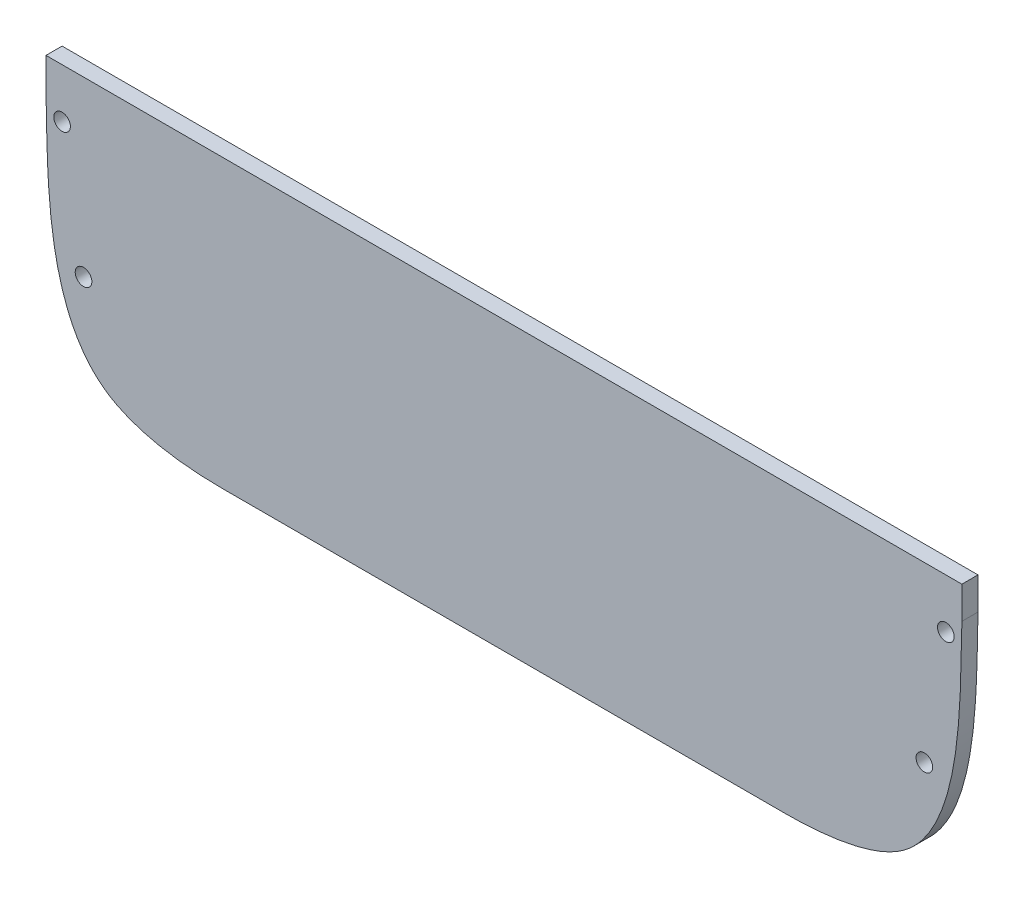
ISO-10303-21;
HEADER;
FILE_DESCRIPTION(('STEP AP214'),'2;1');
FILE_NAME('part.step','',(''),(''),'','','');
FILE_SCHEMA(('AUTOMOTIVE_DESIGN { 1 0 10303 214 1 1 1 1 }'));
ENDSEC;
DATA;
#1=APPLICATION_CONTEXT('core data for automotive mechanical design processes');
#2=APPLICATION_PROTOCOL_DEFINITION('international standard','automotive_design',2000,#1);
#3=PRODUCT_CONTEXT('',#1,'mechanical');
#4=PRODUCT('Part','Part','',(#3));
#5=PRODUCT_RELATED_PRODUCT_CATEGORY('part','',(#4));
#6=PRODUCT_DEFINITION_FORMATION('','',#4);
#7=PRODUCT_DEFINITION_CONTEXT('part definition',#1,'design');
#8=PRODUCT_DEFINITION('design','',#6,#7);
#9=PRODUCT_DEFINITION_SHAPE('','',#8);
#10=(LENGTH_UNIT() NAMED_UNIT(*) SI_UNIT(.MILLI.,.METRE.));
#11=(NAMED_UNIT(*) PLANE_ANGLE_UNIT() SI_UNIT($,.RADIAN.));
#12=(NAMED_UNIT(*) SI_UNIT($,.STERADIAN.) SOLID_ANGLE_UNIT());
#13=UNCERTAINTY_MEASURE_WITH_UNIT(LENGTH_MEASURE(1.E-05),#10,'distance_accuracy_value','');
#14=(GEOMETRIC_REPRESENTATION_CONTEXT(3) GLOBAL_UNCERTAINTY_ASSIGNED_CONTEXT((#13)) GLOBAL_UNIT_ASSIGNED_CONTEXT((#10,
#11,#12)) REPRESENTATION_CONTEXT('',''));
#15=CARTESIAN_POINT('',(0.,0.,0.));
#16=DIRECTION('',(0.,0.,1.));
#17=DIRECTION('',(1.,0.,0.));
#18=AXIS2_PLACEMENT_3D('',#15,#16,#17);
#19=CARTESIAN_POINT('',(105.,-56.,6.));
#20=CARTESIAN_POINT('',(105.641968687663,-55.9999993652091,6.));
#21=CARTESIAN_POINT('',(106.905885896746,-55.9924323496524,6.));
#22=CARTESIAN_POINT('',(109.5935841359,-55.9420924574465,6.));
#23=CARTESIAN_POINT('',(113.112089798758,-55.8039167446171,6.));
#24=CARTESIAN_POINT('',(117.546310091513,-55.4885893167127,6.));
#25=CARTESIAN_POINT('',(123.622789186208,-54.8307609589377,6.));
#26=CARTESIAN_POINT('',(131.329474875731,-53.4957798875544,6.));
#27=CARTESIAN_POINT('',(140.1159887598,-50.8648926962675,6.));
#28=CARTESIAN_POINT('',(147.740986476691,-47.0906402803281,6.));
#29=CARTESIAN_POINT('',(153.788973422215,-41.9963696791788,6.));
#30=CARTESIAN_POINT('',(158.719183517549,-35.5362268455508,6.));
#31=CARTESIAN_POINT('',(163.891886547412,-25.3514251094577,6.));
#32=CARTESIAN_POINT('',(167.170625501384,-13.2342724268467,6.));
#33=CARTESIAN_POINT('',(169.039164203445,-0.266842996610137,6.));
#34=CARTESIAN_POINT('',(169.889474507031,9.60871022523325,6.));
#35=CARTESIAN_POINT('',(170.343400930899,19.3669868942315,6.));
#36=CARTESIAN_POINT('',(170.526148900143,27.1840544966824,6.));
#37=CARTESIAN_POINT('',(170.637287987842,33.1229577325633,6.));
#38=CARTESIAN_POINT('',(170.706798383872,36.5378874436119,6.));
#39=CARTESIAN_POINT('',(170.755319597096,38.4576836054321,6.));
#40=CARTESIAN_POINT('',(170.770080312741,39.0002185189487,6.));
#41=B_SPLINE_CURVE_WITH_KNOTS('',3,(#19,#20,#21,#22,#23,#24,#25,#26,#27,#28,#29,#30,#31,#32,#33,
#34,#35,#36,#37,#38,#39,#40),.UNSPECIFIED.,.F.,.F.,(4,1,1,1,1,1,1,1,1,1,1,1,1,1,1,1,1,1,1,4),
(0.,0.015625,0.03125,0.0625,0.09375,0.125,0.1875,0.25,0.3125,0.375,0.4375,0.5,0.625,0.6875,0.75,
0.8125,0.875,0.90625,0.9375,0.949996941041021),.UNSPECIFIED.);
#42=DIRECTION('',(0.,0.,-1.));
#43=VECTOR('',#42,1.);
#44=SURFACE_OF_LINEAR_EXTRUSION('',#41,#43);
#45=CARTESIAN_POINT('',(105.,-56.,0.));
#46=CARTESIAN_POINT('',(105.641968687663,-55.9999993652091,0.));
#47=CARTESIAN_POINT('',(106.905885896746,-55.9924323496524,0.));
#48=CARTESIAN_POINT('',(109.5935841359,-55.9420924574465,0.));
#49=CARTESIAN_POINT('',(113.112089798758,-55.8039167446171,0.));
#50=CARTESIAN_POINT('',(117.546310091513,-55.4885893167127,0.));
#51=CARTESIAN_POINT('',(123.622789186208,-54.8307609589377,0.));
#52=CARTESIAN_POINT('',(131.329474875731,-53.4957798875544,0.));
#53=CARTESIAN_POINT('',(140.1159887598,-50.8648926962675,0.));
#54=CARTESIAN_POINT('',(147.740986476691,-47.0906402803281,0.));
#55=CARTESIAN_POINT('',(153.788973422215,-41.9963696791788,0.));
#56=CARTESIAN_POINT('',(158.719183517549,-35.5362268455508,0.));
#57=CARTESIAN_POINT('',(163.891886547412,-25.3514251094577,0.));
#58=CARTESIAN_POINT('',(167.170625501384,-13.2342724268467,0.));
#59=CARTESIAN_POINT('',(169.039164203445,-0.266842996610137,0.));
#60=CARTESIAN_POINT('',(169.889474507031,9.60871022523325,0.));
#61=CARTESIAN_POINT('',(170.343400930899,19.3669868942315,0.));
#62=CARTESIAN_POINT('',(170.526148900143,27.1840544966824,0.));
#63=CARTESIAN_POINT('',(170.637287987842,33.1229577325633,0.));
#64=CARTESIAN_POINT('',(170.706798383872,36.5378874436119,0.));
#65=CARTESIAN_POINT('',(170.755319597096,38.4576836054321,0.));
#66=CARTESIAN_POINT('',(170.770080312741,39.0002185189487,0.));
#67=B_SPLINE_CURVE_WITH_KNOTS('',3,(#45,#46,#47,#48,#49,#50,#51,#52,#53,#54,#55,#56,#57,#58,#59,
#60,#61,#62,#63,#64,#65,#66),.UNSPECIFIED.,.F.,.F.,(4,1,1,1,1,1,1,1,1,1,1,1,1,1,1,1,1,1,1,4),
(0.,0.015625,0.03125,0.0625,0.09375,0.125,0.1875,0.25,0.3125,0.375,0.4375,0.5,0.625,0.6875,0.75,
0.8125,0.875,0.90625,0.9375,0.949996941041021),.UNSPECIFIED.);
#68=CARTESIAN_POINT('',(105.,-56.,0.));
#69=VERTEX_POINT('',#68);
#70=CARTESIAN_POINT('',(170.770074367148,39.0001092594202,0.));
#71=VERTEX_POINT('',#70);
#72=EDGE_CURVE('E239',#69,#71,#67,.T.);
#73=ORIENTED_EDGE('',*,*,#72,.T.);
#74=DIRECTION('',(0.,0.,-1.));
#75=VECTOR('',#74,1.);
#76=CARTESIAN_POINT('',(170.770074367148,39.0001092594202,6.));
#77=LINE('',#76,#75);
#78=CARTESIAN_POINT('',(170.770074367148,39.0001092594202,6.));
#79=VERTEX_POINT('',#78);
#80=EDGE_CURVE('E11',#79,#71,#77,.T.);
#81=ORIENTED_EDGE('',*,*,#80,.F.);
#82=CARTESIAN_POINT('',(170.770077337939,39.0001091785949,6.));
#83=CARTESIAN_POINT('',(170.755317734803,38.4576099215474,6.));
#84=CARTESIAN_POINT('',(170.706797605762,36.5378492163535,6.));
#85=CARTESIAN_POINT('',(170.637287987842,33.1229577325633,6.));
#86=CARTESIAN_POINT('',(170.526148900143,27.1840544966824,6.));
#87=CARTESIAN_POINT('',(170.343400930899,19.3669868942315,6.));
#88=CARTESIAN_POINT('',(169.889474507031,9.60871022523325,6.));
#89=CARTESIAN_POINT('',(169.039164203445,-0.266842996610137,6.));
#90=CARTESIAN_POINT('',(167.170625501384,-13.2342724268467,6.));
#91=CARTESIAN_POINT('',(163.891886547412,-25.3514251094577,6.));
#92=CARTESIAN_POINT('',(158.719183517549,-35.5362268455508,6.));
#93=CARTESIAN_POINT('',(153.788973422215,-41.9963696791788,6.));
#94=CARTESIAN_POINT('',(147.740986476691,-47.0906402803281,6.));
#95=CARTESIAN_POINT('',(140.1159887598,-50.8648926962675,6.));
#96=CARTESIAN_POINT('',(131.329474875731,-53.4957798875544,6.));
#97=CARTESIAN_POINT('',(123.622789186208,-54.8307609589377,6.));
#98=CARTESIAN_POINT('',(117.546310091513,-55.4885893167127,6.));
#99=CARTESIAN_POINT('',(113.112089798758,-55.8039167446171,6.));
#100=CARTESIAN_POINT('',(109.5935841359,-55.9420924574465,6.));
#101=CARTESIAN_POINT('',(106.905885896746,-55.9924323496524,6.));
#102=CARTESIAN_POINT('',(105.641968687663,-55.9999993652091,6.));
#103=CARTESIAN_POINT('',(105.,-56.,6.));
#104=B_SPLINE_CURVE_WITH_KNOTS('',3,(#82,#83,#84,#85,#86,#87,#88,#89,#90,#91,#92,#93,#94,#95,
#96,#97,#98,#99,#100,#101,#102,#103),.UNSPECIFIED.,.F.,.F.,(4,1,1,1,1,1,1,1,1,1,1,1,1,1,1,1,1,1,
1,4),(0.,0.0124961015135081,0.0437461015135081,0.0749961015135081,0.137496101513508,
0.199996101513508,0.262496101513508,0.324996101513508,0.449996101513508,0.512496101513508,
0.574996101513508,0.637496101513508,0.699996101513508,0.762496101513508,0.824996101513508,
0.856246101513508,0.887496101513508,0.918746101513508,0.934371101513508,0.949996101513508),.UNSPECIFIED.);
#105=CARTESIAN_POINT('',(105.,-56.,6.));
#106=VERTEX_POINT('',#105);
#107=EDGE_CURVE('E186',#106,#79,#104,.F.);
#108=ORIENTED_EDGE('',*,*,#107,.F.);
#109=DIRECTION('',(0.,0.,-1.));
#110=VECTOR('',#109,1.);
#111=CARTESIAN_POINT('',(105.,-56.,6.));
#112=LINE('',#111,#110);
#113=EDGE_CURVE('E170',#106,#69,#112,.T.);
#114=ORIENTED_EDGE('',*,*,#113,.T.);
#115=EDGE_LOOP('',(#73,#81,#108,#114));
#116=FACE_BOUND('',#115,.T.);
#117=ADVANCED_FACE('F39',(#116),#44,.F.);
#118=CARTESIAN_POINT('',(170.7700550437,-8.46115385921929E-05,6.));
#119=DIRECTION('',(-0.999999999999877,4.95470582184509E-07,0.));
#120=DIRECTION('',(-4.95470582184509E-07,-0.999999999999877,0.));
#121=AXIS2_PLACEMENT_3D('',#118,#119,#120);
#122=PLANE('',#121);
#123=DIRECTION('',(4.95470582184509E-07,0.999999999999877,0.));
#124=VECTOR('',#123,1.);
#125=CARTESIAN_POINT('',(170.7700550437,-8.46115385921929E-05,0.));
#126=LINE('',#125,#124);
#127=CARTESIAN_POINT('',(170.770080312741,51.,0.));
#128=VERTEX_POINT('',#127);
#129=EDGE_CURVE('E173',#71,#128,#126,.T.);
#130=ORIENTED_EDGE('',*,*,#129,.T.);
#131=DIRECTION('',(0.,0.,-1.));
#132=VECTOR('',#131,1.);
#133=CARTESIAN_POINT('',(170.770080312741,51.,6.));
#134=LINE('',#133,#132);
#135=CARTESIAN_POINT('',(170.770080312741,51.,6.));
#136=VERTEX_POINT('',#135);
#137=EDGE_CURVE('E50',#136,#128,#134,.T.);
#138=ORIENTED_EDGE('',*,*,#137,.F.);
#139=DIRECTION('',(4.95470582184509E-07,0.999999999999877,0.));
#140=VECTOR('',#139,1.);
#141=CARTESIAN_POINT('',(170.7700550437,-8.46115385921929E-05,6.));
#142=LINE('',#141,#140);
#143=EDGE_CURVE('E97',#79,#136,#142,.T.);
#144=ORIENTED_EDGE('',*,*,#143,.F.);
#145=ORIENTED_EDGE('',*,*,#80,.T.);
#146=EDGE_LOOP('',(#130,#138,#144,#145));
#147=FACE_BOUND('',#146,.T.);
#148=ADVANCED_FACE('F292',(#147),#122,.F.);
#149=CARTESIAN_POINT('',(-1.80482557077485E-13,50.9999999999994,6.));
#150=DIRECTION('',(0.,-1.,0.));
#151=DIRECTION('',(1.,0.,0.));
#152=AXIS2_PLACEMENT_3D('',#149,#150,#151);
#153=PLANE('',#152);
#154=DIRECTION('',(-1.,0.,0.));
#155=VECTOR('',#154,1.);
#156=CARTESIAN_POINT('',(-1.80482557077485E-13,50.9999999999994,0.));
#157=LINE('',#156,#155);
#158=CARTESIAN_POINT('',(-170.770080312741,51.,0.));
#159=VERTEX_POINT('',#158);
#160=EDGE_CURVE('E171',#128,#159,#157,.T.);
#161=ORIENTED_EDGE('',*,*,#160,.T.);
#162=DIRECTION('',(0.,0.,-1.));
#163=VECTOR('',#162,1.);
#164=CARTESIAN_POINT('',(-170.770080312741,51.,6.));
#165=LINE('',#164,#163);
#166=CARTESIAN_POINT('',(-170.770080312741,51.,6.));
#167=VERTEX_POINT('',#166);
#168=EDGE_CURVE('E121',#167,#159,#165,.T.);
#169=ORIENTED_EDGE('',*,*,#168,.F.);
#170=DIRECTION('',(-1.,0.,0.));
#171=VECTOR('',#170,1.);
#172=CARTESIAN_POINT('',(-1.80482557077485E-13,50.9999999999994,6.));
#173=LINE('',#172,#171);
#174=EDGE_CURVE('E112',#136,#167,#173,.T.);
#175=ORIENTED_EDGE('',*,*,#174,.F.);
#176=ORIENTED_EDGE('',*,*,#137,.T.);
#177=EDGE_LOOP('',(#161,#169,#175,#176));
#178=FACE_BOUND('',#177,.T.);
#179=ADVANCED_FACE('F191',(#178),#153,.F.);
#180=CARTESIAN_POINT('',(-170.770067678295,-4.2305558737423E-05,6.));
#181=DIRECTION('',(0.999999999999969,2.47734039768135E-07,0.));
#182=DIRECTION('',(-2.47734039768135E-07,0.999999999999969,0.));
#183=AXIS2_PLACEMENT_3D('',#180,#181,#182);
#184=PLANE('',#183);
#185=DIRECTION('',(2.47734039768135E-07,-0.999999999999969,0.));
#186=VECTOR('',#185,1.);
#187=CARTESIAN_POINT('',(-170.770067678295,-4.2305558737423E-05,0.));
#188=LINE('',#187,#186);
#189=CARTESIAN_POINT('',(-170.77007733996,39.0001092594744,0.));
#190=VERTEX_POINT('',#189);
#191=EDGE_CURVE('E120',#159,#190,#188,.T.);
#192=ORIENTED_EDGE('',*,*,#191,.T.);
#193=DIRECTION('',(0.,0.,-1.));
#194=VECTOR('',#193,1.);
#195=CARTESIAN_POINT('',(-170.77007733996,39.0001092594744,6.));
#196=LINE('',#195,#194);
#197=CARTESIAN_POINT('',(-170.77007733996,39.0001092594744,6.));
#198=VERTEX_POINT('',#197);
#199=EDGE_CURVE('E117',#198,#190,#196,.T.);
#200=ORIENTED_EDGE('',*,*,#199,.F.);
#201=DIRECTION('',(2.47734039768135E-07,-0.999999999999969,0.));
#202=VECTOR('',#201,1.);
#203=CARTESIAN_POINT('',(-170.770067678295,-4.2305558737423E-05,6.));
#204=LINE('',#203,#202);
#205=EDGE_CURVE('E104',#167,#198,#204,.T.);
#206=ORIENTED_EDGE('',*,*,#205,.F.);
#207=ORIENTED_EDGE('',*,*,#168,.T.);
#208=EDGE_LOOP('',(#192,#200,#206,#207));
#209=FACE_BOUND('',#208,.T.);
#210=ADVANCED_FACE('F118',(#209),#184,.F.);
#211=CARTESIAN_POINT('',(-170.770080312741,39.0002185189482,6.));
#212=CARTESIAN_POINT('',(-170.755319597046,38.457683604145,6.));
#213=CARTESIAN_POINT('',(-170.706798383747,36.5378874410862,6.));
#214=CARTESIAN_POINT('',(-170.637287987626,33.1229577287414,6.));
#215=CARTESIAN_POINT('',(-170.526148899818,27.1840544930346,6.));
#216=CARTESIAN_POINT('',(-170.343400930431,19.3669868908134,6.));
#217=CARTESIAN_POINT('',(-169.889474506392,9.60871022210638,6.));
#218=CARTESIAN_POINT('',(-169.039164202644,-0.266842999434943,6.));
#219=CARTESIAN_POINT('',(-167.170625500392,-13.2342724292607,6.));
#220=CARTESIAN_POINT('',(-163.891886546286,-25.3514251114587,6.));
#221=CARTESIAN_POINT('',(-158.71918351638,-35.5362268471591,6.));
#222=CARTESIAN_POINT('',(-153.788973421066,-41.9963696805067,6.));
#223=CARTESIAN_POINT('',(-147.740986475621,-47.0906402813942,6.));
#224=CARTESIAN_POINT('',(-140.11598875888,-50.8648926970801,6.));
#225=CARTESIAN_POINT('',(-131.329474875016,-53.4957798881247,6.));
#226=CARTESIAN_POINT('',(-123.622789185691,-54.8307609593236,6.));
#227=CARTESIAN_POINT('',(-117.546310091159,-55.4885893169647,6.));
#228=CARTESIAN_POINT('',(-113.112089798527,-55.8039167447762,6.));
#229=CARTESIAN_POINT('',(-109.593584135768,-55.942092457535,6.));
#230=CARTESIAN_POINT('',(-106.905885896691,-55.9924323496887,6.));
#231=CARTESIAN_POINT('',(-105.641968687644,-55.9999993652212,6.));
#232=CARTESIAN_POINT('',(-105.,-56.,6.));
#233=B_SPLINE_CURVE_WITH_KNOTS('',3,(#211,#212,#213,#214,#215,#216,#217,#218,#219,#220,#221,
#222,#223,#224,#225,#226,#227,#228,#229,#230,#231,#232),.UNSPECIFIED.,.F.,.F.,(4,1,1,1,1,1,1,1,
1,1,1,1,1,1,1,1,1,1,1,4),(0.0500030589283113,0.0625,0.09375,0.125,0.1875,0.25,0.3125,0.375,0.5,
0.5625,0.625,0.6875,0.75,0.8125,0.875,0.90625,0.9375,0.96875,0.984375,1.),.UNSPECIFIED.);
#234=DIRECTION('',(0.,0.,-1.));
#235=VECTOR('',#234,1.);
#236=SURFACE_OF_LINEAR_EXTRUSION('',#233,#235);
#237=CARTESIAN_POINT('',(-170.770080312741,39.0002185189482,0.));
#238=CARTESIAN_POINT('',(-170.755319597046,38.457683604145,0.));
#239=CARTESIAN_POINT('',(-170.706798383747,36.5378874410862,0.));
#240=CARTESIAN_POINT('',(-170.637287987626,33.1229577287414,0.));
#241=CARTESIAN_POINT('',(-170.526148899818,27.1840544930346,0.));
#242=CARTESIAN_POINT('',(-170.343400930431,19.3669868908134,0.));
#243=CARTESIAN_POINT('',(-169.889474506392,9.60871022210638,0.));
#244=CARTESIAN_POINT('',(-169.039164202644,-0.266842999434943,0.));
#245=CARTESIAN_POINT('',(-167.170625500392,-13.2342724292607,0.));
#246=CARTESIAN_POINT('',(-163.891886546286,-25.3514251114587,0.));
#247=CARTESIAN_POINT('',(-158.71918351638,-35.5362268471591,0.));
#248=CARTESIAN_POINT('',(-153.788973421066,-41.9963696805067,0.));
#249=CARTESIAN_POINT('',(-147.740986475621,-47.0906402813942,0.));
#250=CARTESIAN_POINT('',(-140.11598875888,-50.8648926970801,0.));
#251=CARTESIAN_POINT('',(-131.329474875016,-53.4957798881247,0.));
#252=CARTESIAN_POINT('',(-123.622789185691,-54.8307609593236,0.));
#253=CARTESIAN_POINT('',(-117.546310091159,-55.4885893169647,0.));
#254=CARTESIAN_POINT('',(-113.112089798527,-55.8039167447762,0.));
#255=CARTESIAN_POINT('',(-109.593584135768,-55.942092457535,0.));
#256=CARTESIAN_POINT('',(-106.905885896691,-55.9924323496887,0.));
#257=CARTESIAN_POINT('',(-105.641968687644,-55.9999993652212,0.));
#258=CARTESIAN_POINT('',(-105.,-56.,0.));
#259=B_SPLINE_CURVE_WITH_KNOTS('',3,(#237,#238,#239,#240,#241,#242,#243,#244,#245,#246,#247,
#248,#249,#250,#251,#252,#253,#254,#255,#256,#257,#258),.UNSPECIFIED.,.F.,.F.,(4,1,1,1,1,1,1,1,
1,1,1,1,1,1,1,1,1,1,1,4),(0.0500030589283113,0.0625,0.09375,0.125,0.1875,0.25,0.3125,0.375,0.5,
0.5625,0.625,0.6875,0.75,0.8125,0.875,0.90625,0.9375,0.96875,0.984375,1.),.UNSPECIFIED.);
#260=CARTESIAN_POINT('',(-105.,-56.,0.));
#261=VERTEX_POINT('',#260);
#262=EDGE_CURVE('E82',#190,#261,#259,.T.);
#263=ORIENTED_EDGE('',*,*,#262,.T.);
#264=DIRECTION('',(0.,0.,-1.));
#265=VECTOR('',#264,1.);
#266=CARTESIAN_POINT('',(-105.,-56.,6.));
#267=LINE('',#266,#265);
#268=CARTESIAN_POINT('',(-105.,-56.,6.));
#269=VERTEX_POINT('',#268);
#270=EDGE_CURVE('E122',#269,#261,#267,.T.);
#271=ORIENTED_EDGE('',*,*,#270,.F.);
#272=CARTESIAN_POINT('',(-105.,-56.,6.));
#273=CARTESIAN_POINT('',(-105.641968687644,-55.9999993652212,6.));
#274=CARTESIAN_POINT('',(-106.905885896691,-55.9924323496887,6.));
#275=CARTESIAN_POINT('',(-109.593584135768,-55.942092457535,6.));
#276=CARTESIAN_POINT('',(-113.112089798527,-55.8039167447762,6.));
#277=CARTESIAN_POINT('',(-117.546310091159,-55.4885893169647,6.));
#278=CARTESIAN_POINT('',(-123.622789185691,-54.8307609593236,6.));
#279=CARTESIAN_POINT('',(-131.329474875016,-53.4957798881247,6.));
#280=CARTESIAN_POINT('',(-140.11598875888,-50.8648926970801,6.));
#281=CARTESIAN_POINT('',(-147.740986475621,-47.0906402813942,6.));
#282=CARTESIAN_POINT('',(-153.788973421066,-41.9963696805067,6.));
#283=CARTESIAN_POINT('',(-158.71918351638,-35.5362268471591,6.));
#284=CARTESIAN_POINT('',(-163.891886546286,-25.3514251114587,6.));
#285=CARTESIAN_POINT('',(-167.170625500392,-13.2342724292607,6.));
#286=CARTESIAN_POINT('',(-169.039164202644,-0.266842999434943,6.));
#287=CARTESIAN_POINT('',(-169.889474506392,9.60871022210638,6.));
#288=CARTESIAN_POINT('',(-170.343400930431,19.3669868908134,6.));
#289=CARTESIAN_POINT('',(-170.526148899818,27.1840544930346,6.));
#290=CARTESIAN_POINT('',(-170.637287987626,33.1229577287414,6.));
#291=CARTESIAN_POINT('',(-170.706797606212,36.5378492421031,6.));
#292=CARTESIAN_POINT('',(-170.75531773613,38.4576099747616,6.));
#293=CARTESIAN_POINT('',(-170.770077340139,39.0001092594695,6.));
#294=B_SPLINE_CURVE_WITH_KNOTS('',3,(#272,#273,#274,#275,#276,#277,#278,#279,#280,#281,#282,
#283,#284,#285,#286,#287,#288,#289,#290,#291,#292,#293),.UNSPECIFIED.,.F.,.F.,(4,1,1,1,1,1,1,1,
1,1,1,1,1,1,1,1,1,1,1,4),(0.0500038978348565,0.0656288978348565,0.0812538978348565,
0.112503897834856,0.143753897834856,0.175003897834856,0.237503897834856,0.300003897834856,
0.362503897834856,0.425003897834856,0.487503897834856,0.550003897834856,0.675003897834856,
0.737503897834856,0.800003897834856,0.862503897834856,0.925003897834856,0.956253897834856,
0.987503897834856,1.),.UNSPECIFIED.);
#295=EDGE_CURVE('E109',#198,#269,#294,.F.);
#296=ORIENTED_EDGE('',*,*,#295,.F.);
#297=ORIENTED_EDGE('',*,*,#199,.T.);
#298=EDGE_LOOP('',(#263,#271,#296,#297));
#299=FACE_BOUND('',#298,.T.);
#300=ADVANCED_FACE('F125',(#299),#236,.F.);
#301=CARTESIAN_POINT('',(-156.770064317581,-13.5658549238992,6.));
#302=DIRECTION('',(0.,0.,-1.));
#303=DIRECTION('',(-1.,0.,0.));
#304=AXIS2_PLACEMENT_3D('',#301,#302,#303);
#305=CYLINDRICAL_SURFACE('',#304,3.09999999999999);
#306=CARTESIAN_POINT('',(-156.770064317581,-13.5658549238992,6.));
#307=DIRECTION('',(0.,0.,1.));
#308=DIRECTION('',(1.,0.,0.));
#309=AXIS2_PLACEMENT_3D('',#306,#307,#308);
#310=CIRCLE('',#309,3.09999999999999);
#311=CARTESIAN_POINT('',(-153.670064317581,-13.5658549238992,6.));
#312=VERTEX_POINT('',#311);
#313=EDGE_CURVE('E164',#312,#312,#310,.T.);
#314=ORIENTED_EDGE('',*,*,#313,.T.);
#315=EDGE_LOOP('',(#314));
#316=FACE_BOUND('',#315,.T.);
#317=CARTESIAN_POINT('',(-156.770064317581,-13.5658549238992,0.));
#318=DIRECTION('',(0.,0.,1.));
#319=DIRECTION('',(1.,0.,0.));
#320=AXIS2_PLACEMENT_3D('',#317,#318,#319);
#321=CIRCLE('',#320,3.09999999999999);
#322=CARTESIAN_POINT('',(-153.670064317581,-13.5658549238992,0.));
#323=VERTEX_POINT('',#322);
#324=EDGE_CURVE('E180',#323,#323,#321,.T.);
#325=ORIENTED_EDGE('',*,*,#324,.F.);
#326=EDGE_LOOP('',(#325));
#327=FACE_BOUND('',#326,.T.);
#328=ADVANCED_FACE('F145',(#316,#327),#305,.F.);
#329=CARTESIAN_POINT('',(-164.770080312741,32.554491259822,6.));
#330=DIRECTION('',(0.,0.,-1.));
#331=DIRECTION('',(-1.,0.,0.));
#332=AXIS2_PLACEMENT_3D('',#329,#330,#331);
#333=CYLINDRICAL_SURFACE('',#332,3.09999999999999);
#334=CARTESIAN_POINT('',(-164.770080312741,32.554491259822,6.));
#335=DIRECTION('',(0.,0.,1.));
#336=DIRECTION('',(1.,0.,0.));
#337=AXIS2_PLACEMENT_3D('',#334,#335,#336);
#338=CIRCLE('',#337,3.09999999999999);
#339=CARTESIAN_POINT('',(-161.670080312741,32.554491259822,6.));
#340=VERTEX_POINT('',#339);
#341=EDGE_CURVE('E161',#340,#340,#338,.T.);
#342=ORIENTED_EDGE('',*,*,#341,.T.);
#343=EDGE_LOOP('',(#342));
#344=FACE_BOUND('',#343,.T.);
#345=CARTESIAN_POINT('',(-164.770080312741,32.554491259822,0.));
#346=DIRECTION('',(0.,0.,1.));
#347=DIRECTION('',(1.,0.,0.));
#348=AXIS2_PLACEMENT_3D('',#345,#346,#347);
#349=CIRCLE('',#348,3.09999999999999);
#350=CARTESIAN_POINT('',(-161.670080312741,32.554491259822,0.));
#351=VERTEX_POINT('',#350);
#352=EDGE_CURVE('E177',#351,#351,#349,.T.);
#353=ORIENTED_EDGE('',*,*,#352,.F.);
#354=EDGE_LOOP('',(#353));
#355=FACE_BOUND('',#354,.T.);
#356=ADVANCED_FACE('F289',(#344,#355),#333,.F.);
#357=CARTESIAN_POINT('',(156.770064317581,-13.5658549238992,6.));
#358=DIRECTION('',(0.,0.,-1.));
#359=DIRECTION('',(-1.,0.,0.));
#360=AXIS2_PLACEMENT_3D('',#357,#358,#359);
#361=CYLINDRICAL_SURFACE('',#360,3.09999999999999);
#362=CARTESIAN_POINT('',(156.770064317581,-13.5658549238992,6.));
#363=DIRECTION('',(0.,0.,1.));
#364=DIRECTION('',(1.,0.,0.));
#365=AXIS2_PLACEMENT_3D('',#362,#363,#364);
#366=CIRCLE('',#365,3.09999999999999);
#367=CARTESIAN_POINT('',(159.870064317581,-13.5658549238992,6.));
#368=VERTEX_POINT('',#367);
#369=EDGE_CURVE('E155',#368,#368,#366,.F.);
#370=ORIENTED_EDGE('',*,*,#369,.F.);
#371=EDGE_LOOP('',(#370));
#372=FACE_BOUND('',#371,.T.);
#373=CARTESIAN_POINT('',(156.770064317581,-13.5658549238992,0.));
#374=DIRECTION('',(0.,0.,1.));
#375=DIRECTION('',(1.,0.,0.));
#376=AXIS2_PLACEMENT_3D('',#373,#374,#375);
#377=CIRCLE('',#376,3.09999999999999);
#378=CARTESIAN_POINT('',(159.870064317581,-13.5658549238992,0.));
#379=VERTEX_POINT('',#378);
#380=EDGE_CURVE('E174',#379,#379,#377,.F.);
#381=ORIENTED_EDGE('',*,*,#380,.T.);
#382=EDGE_LOOP('',(#381));
#383=FACE_BOUND('',#382,.T.);
#384=ADVANCED_FACE('F283',(#372,#383),#361,.F.);
#385=CARTESIAN_POINT('',(0.,-56.,6.));
#386=DIRECTION('',(0.,1.,0.));
#387=DIRECTION('',(0.,0.,1.));
#388=AXIS2_PLACEMENT_3D('',#385,#386,#387);
#389=PLANE('',#388);
#390=DIRECTION('',(1.,0.,0.));
#391=VECTOR('',#390,1.);
#392=CARTESIAN_POINT('',(0.,-56.,0.));
#393=LINE('',#392,#391);
#394=EDGE_CURVE('E89',#261,#69,#393,.T.);
#395=ORIENTED_EDGE('',*,*,#394,.T.);
#396=ORIENTED_EDGE('',*,*,#113,.F.);
#397=DIRECTION('',(1.,0.,0.));
#398=VECTOR('',#397,1.);
#399=CARTESIAN_POINT('',(0.,-56.,6.));
#400=LINE('',#399,#398);
#401=EDGE_CURVE('E59',#269,#106,#400,.T.);
#402=ORIENTED_EDGE('',*,*,#401,.F.);
#403=ORIENTED_EDGE('',*,*,#270,.T.);
#404=EDGE_LOOP('',(#395,#396,#402,#403));
#405=FACE_BOUND('',#404,.T.);
#406=ADVANCED_FACE('F146',(#405),#389,.F.);
#407=CARTESIAN_POINT('',(164.770080312741,32.554491259822,6.));
#408=DIRECTION('',(0.,0.,-1.));
#409=DIRECTION('',(-1.,0.,0.));
#410=AXIS2_PLACEMENT_3D('',#407,#408,#409);
#411=CYLINDRICAL_SURFACE('',#410,3.09999999999999);
#412=CARTESIAN_POINT('',(164.770080312741,32.554491259822,6.));
#413=DIRECTION('',(0.,0.,1.));
#414=DIRECTION('',(1.,0.,0.));
#415=AXIS2_PLACEMENT_3D('',#412,#413,#414);
#416=CIRCLE('',#415,3.09999999999999);
#417=CARTESIAN_POINT('',(167.870080312741,32.554491259822,6.));
#418=VERTEX_POINT('',#417);
#419=EDGE_CURVE('E167',#418,#418,#416,.T.);
#420=ORIENTED_EDGE('',*,*,#419,.T.);
#421=EDGE_LOOP('',(#420));
#422=FACE_BOUND('',#421,.T.);
#423=CARTESIAN_POINT('',(164.770080312741,32.554491259822,0.));
#424=DIRECTION('',(0.,0.,1.));
#425=DIRECTION('',(1.,0.,0.));
#426=AXIS2_PLACEMENT_3D('',#423,#424,#425);
#427=CIRCLE('',#426,3.09999999999999);
#428=CARTESIAN_POINT('',(167.870080312741,32.554491259822,0.));
#429=VERTEX_POINT('',#428);
#430=EDGE_CURVE('E183',#429,#429,#427,.T.);
#431=ORIENTED_EDGE('',*,*,#430,.F.);
#432=EDGE_LOOP('',(#431));
#433=FACE_BOUND('',#432,.T.);
#434=ADVANCED_FACE('F222',(#422,#433),#411,.F.);
#435=CARTESIAN_POINT('',(0.,0.,6.));
#436=DIRECTION('',(0.,0.,1.));
#437=DIRECTION('',(1.,0.,0.));
#438=AXIS2_PLACEMENT_3D('',#435,#436,#437);
#439=PLANE('',#438);
#440=ORIENTED_EDGE('',*,*,#107,.T.);
#441=ORIENTED_EDGE('',*,*,#143,.T.);
#442=ORIENTED_EDGE('',*,*,#174,.T.);
#443=ORIENTED_EDGE('',*,*,#205,.T.);
#444=ORIENTED_EDGE('',*,*,#295,.T.);
#445=ORIENTED_EDGE('',*,*,#401,.T.);
#446=EDGE_LOOP('',(#440,#441,#442,#443,#444,#445));
#447=FACE_BOUND('',#446,.T.);
#448=ORIENTED_EDGE('',*,*,#369,.T.);
#449=EDGE_LOOP('',(#448));
#450=FACE_BOUND('',#449,.T.);
#451=ORIENTED_EDGE('',*,*,#341,.F.);
#452=EDGE_LOOP('',(#451));
#453=FACE_BOUND('',#452,.T.);
#454=ORIENTED_EDGE('',*,*,#313,.F.);
#455=EDGE_LOOP('',(#454));
#456=FACE_BOUND('',#455,.T.);
#457=ORIENTED_EDGE('',*,*,#419,.F.);
#458=EDGE_LOOP('',(#457));
#459=FACE_BOUND('',#458,.T.);
#460=ADVANCED_FACE('F106',(#447,#450,#453,#456,#459),#439,.T.);
#461=CARTESIAN_POINT('',(0.,0.,0.));
#462=DIRECTION('',(0.,0.,1.));
#463=DIRECTION('',(1.,0.,0.));
#464=AXIS2_PLACEMENT_3D('',#461,#462,#463);
#465=PLANE('',#464);
#466=ORIENTED_EDGE('',*,*,#72,.F.);
#467=ORIENTED_EDGE('',*,*,#394,.F.);
#468=ORIENTED_EDGE('',*,*,#262,.F.);
#469=ORIENTED_EDGE('',*,*,#191,.F.);
#470=ORIENTED_EDGE('',*,*,#160,.F.);
#471=ORIENTED_EDGE('',*,*,#129,.F.);
#472=EDGE_LOOP('',(#466,#467,#468,#469,#470,#471));
#473=FACE_BOUND('',#472,.T.);
#474=ORIENTED_EDGE('',*,*,#380,.F.);
#475=EDGE_LOOP('',(#474));
#476=FACE_BOUND('',#475,.T.);
#477=ORIENTED_EDGE('',*,*,#352,.T.);
#478=EDGE_LOOP('',(#477));
#479=FACE_BOUND('',#478,.T.);
#480=ORIENTED_EDGE('',*,*,#324,.T.);
#481=EDGE_LOOP('',(#480));
#482=FACE_BOUND('',#481,.T.);
#483=ORIENTED_EDGE('',*,*,#430,.T.);
#484=EDGE_LOOP('',(#483));
#485=FACE_BOUND('',#484,.T.);
#486=ADVANCED_FACE('F194',(#473,#476,#479,#482,#485),#465,.F.);
#487=CLOSED_SHELL('',(#117,#148,#179,#210,#300,#328,#356,#384,#406,#434,#460,#486));
#488=MANIFOLD_SOLID_BREP('B2',#487);
#489=ADVANCED_BREP_SHAPE_REPRESENTATION('',(#18,#488),#14);
#490=SHAPE_DEFINITION_REPRESENTATION(#9,#489);
ENDSEC;
END-ISO-10303-21;
